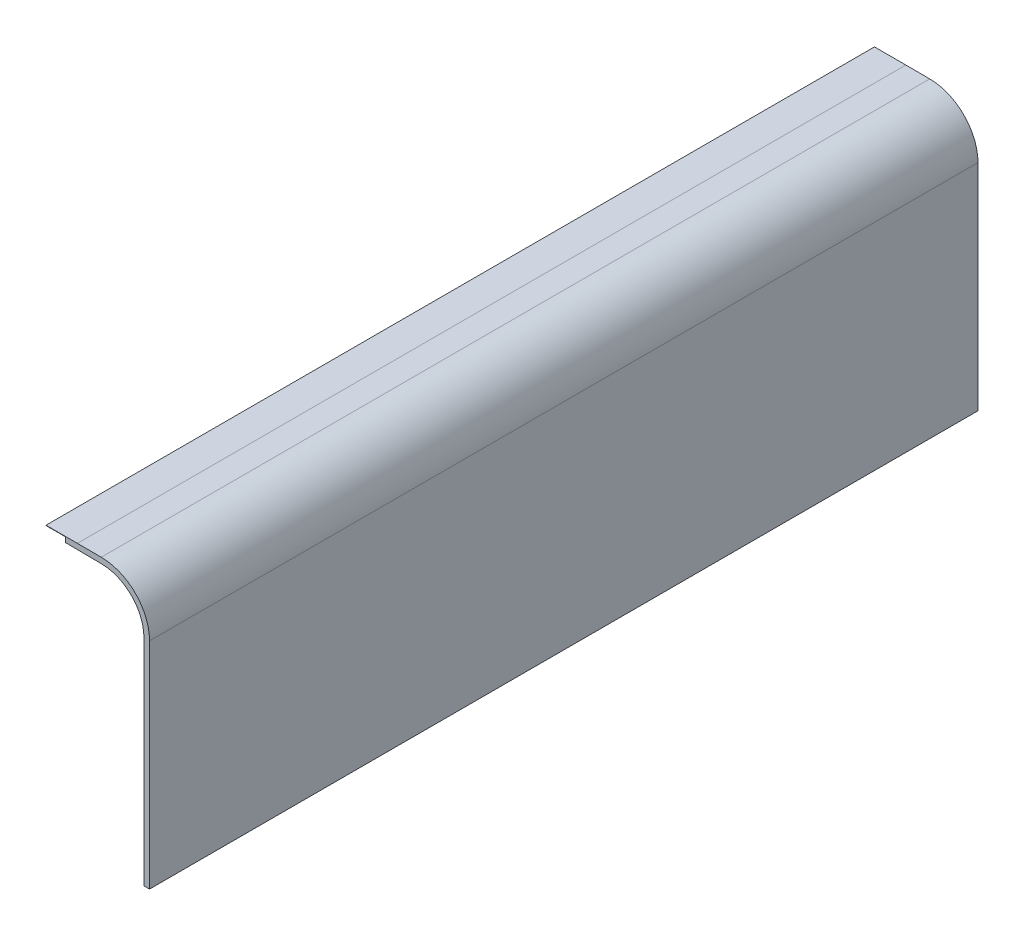
ISO-10303-21;
HEADER;
FILE_DESCRIPTION(('STEP AP214'),'2;1');
FILE_NAME('part.step','',(''),(''),'','','');
FILE_SCHEMA(('AUTOMOTIVE_DESIGN { 1 0 10303 214 1 1 1 1 }'));
ENDSEC;
DATA;
#1=APPLICATION_CONTEXT('core data for automotive mechanical design processes');
#2=APPLICATION_PROTOCOL_DEFINITION('international standard','automotive_design',2000,#1);
#3=PRODUCT_CONTEXT('',#1,'mechanical');
#4=PRODUCT('Part','Part','',(#3));
#5=PRODUCT_RELATED_PRODUCT_CATEGORY('part','',(#4));
#6=PRODUCT_DEFINITION_FORMATION('','',#4);
#7=PRODUCT_DEFINITION_CONTEXT('part definition',#1,'design');
#8=PRODUCT_DEFINITION('design','',#6,#7);
#9=PRODUCT_DEFINITION_SHAPE('','',#8);
#10=(LENGTH_UNIT() NAMED_UNIT(*) SI_UNIT(.MILLI.,.METRE.));
#11=(NAMED_UNIT(*) PLANE_ANGLE_UNIT() SI_UNIT($,.RADIAN.));
#12=(NAMED_UNIT(*) SI_UNIT($,.STERADIAN.) SOLID_ANGLE_UNIT());
#13=UNCERTAINTY_MEASURE_WITH_UNIT(LENGTH_MEASURE(1.E-05),#10,'distance_accuracy_value','');
#14=(GEOMETRIC_REPRESENTATION_CONTEXT(3) GLOBAL_UNCERTAINTY_ASSIGNED_CONTEXT((#13)) GLOBAL_UNIT_ASSIGNED_CONTEXT((#10,
#11,#12)) REPRESENTATION_CONTEXT('',''));
#15=CARTESIAN_POINT('',(0.,0.,0.));
#16=DIRECTION('',(0.,0.,1.));
#17=DIRECTION('',(1.,0.,0.));
#18=AXIS2_PLACEMENT_3D('',#15,#16,#17);
#19=CARTESIAN_POINT('',(459.721789204401,-469.899999999951,-1983.03160275972));
#20=DIRECTION('',(0.,-1.,0.));
#21=DIRECTION('',(0.,0.,-1.));
#22=AXIS2_PLACEMENT_3D('',#19,#20,#21);
#23=PLANE('',#22);
#24=DIRECTION('',(-1.,0.,0.));
#25=VECTOR('',#24,1.);
#26=CARTESIAN_POINT('',(459.721789204401,-469.899999999951,-1478.12000003458));
#27=LINE('',#26,#25);
#28=CARTESIAN_POINT('',(469.721789204401,-469.899999999951,-1478.12000003458));
#29=VERTEX_POINT('',#28);
#30=CARTESIAN_POINT('',(459.721789204401,-469.899999999951,-1478.12000003458));
#31=VERTEX_POINT('',#30);
#32=EDGE_CURVE('E43',#29,#31,#27,.T.);
#33=ORIENTED_EDGE('',*,*,#32,.F.);
#34=DIRECTION('',(0.,0.,1.));
#35=VECTOR('',#34,1.);
#36=CARTESIAN_POINT('',(469.721789204401,-469.899999999951,-1983.03160275972));
#37=LINE('',#36,#35);
#38=CARTESIAN_POINT('',(469.721789204401,-469.899999999951,0.));
#39=VERTEX_POINT('',#38);
#40=EDGE_CURVE('E116',#29,#39,#37,.T.);
#41=ORIENTED_EDGE('',*,*,#40,.T.);
#42=DIRECTION('',(1.,0.,0.));
#43=VECTOR('',#42,1.);
#44=CARTESIAN_POINT('',(459.721789204401,-469.899999999951,0.));
#45=LINE('',#44,#43);
#46=CARTESIAN_POINT('',(459.721789204401,-469.899999999951,0.));
#47=VERTEX_POINT('',#46);
#48=EDGE_CURVE('E120',#47,#39,#45,.T.);
#49=ORIENTED_EDGE('',*,*,#48,.F.);
#50=DIRECTION('',(0.,0.,1.));
#51=VECTOR('',#50,1.);
#52=CARTESIAN_POINT('',(459.721789204401,-469.899999999951,-1983.03160275972));
#53=LINE('',#52,#51);
#54=EDGE_CURVE('E164',#31,#47,#53,.T.);
#55=ORIENTED_EDGE('',*,*,#54,.F.);
#56=EDGE_LOOP('',(#33,#41,#49,#55));
#57=FACE_BOUND('',#56,.T.);
#58=ADVANCED_FACE('F36',(#57),#23,.T.);
#59=CARTESIAN_POINT('',(459.721789204401,-469.899999999951,-1983.03160275972));
#60=DIRECTION('',(-1.,0.,0.));
#61=DIRECTION('',(0.,0.,1.));
#62=AXIS2_PLACEMENT_3D('',#59,#60,#61);
#63=PLANE('',#62);
#64=DIRECTION('',(0.,1.,0.));
#65=VECTOR('',#64,1.);
#66=CARTESIAN_POINT('',(459.721789204401,-469.899999999951,-1478.12000003458));
#67=LINE('',#66,#65);
#68=CARTESIAN_POINT('',(459.721789204401,-86.3600000000001,-1478.12000003458));
#69=VERTEX_POINT('',#68);
#70=EDGE_CURVE('E225',#31,#69,#67,.T.);
#71=ORIENTED_EDGE('',*,*,#70,.F.);
#72=ORIENTED_EDGE('',*,*,#54,.T.);
#73=DIRECTION('',(0.,-1.,0.));
#74=VECTOR('',#73,1.);
#75=CARTESIAN_POINT('',(459.721789204401,-469.899999999951,0.));
#76=LINE('',#75,#74);
#77=CARTESIAN_POINT('',(459.721789204401,-86.3600000000001,0.));
#78=VERTEX_POINT('',#77);
#79=EDGE_CURVE('E125',#78,#47,#76,.T.);
#80=ORIENTED_EDGE('',*,*,#79,.F.);
#81=DIRECTION('',(0.,0.,1.));
#82=VECTOR('',#81,1.);
#83=CARTESIAN_POINT('',(459.721789204401,-86.3600000000001,-1983.03160275972));
#84=LINE('',#83,#82);
#85=EDGE_CURVE('E167',#69,#78,#84,.T.);
#86=ORIENTED_EDGE('',*,*,#85,.F.);
#87=EDGE_LOOP('',(#71,#72,#80,#86));
#88=FACE_BOUND('',#87,.T.);
#89=ADVANCED_FACE('F224',(#88),#63,.T.);
#90=CARTESIAN_POINT('',(383.521789204401,-86.3600000000001,-1983.03160275972));
#91=DIRECTION('',(0.,0.,1.));
#92=DIRECTION('',(1.,0.,0.));
#93=AXIS2_PLACEMENT_3D('',#90,#91,#92);
#94=CYLINDRICAL_SURFACE('',#93,76.2);
#95=CARTESIAN_POINT('',(383.521789204401,-86.3600000000001,-1478.12000003458));
#96=DIRECTION('',(0.,0.,1.));
#97=DIRECTION('',(1.,0.,0.));
#98=AXIS2_PLACEMENT_3D('',#95,#96,#97);
#99=CIRCLE('',#98,76.2);
#100=CARTESIAN_POINT('',(383.521789204401,-10.1600000000001,-1478.12000003458));
#101=VERTEX_POINT('',#100);
#102=EDGE_CURVE('E226',#69,#101,#99,.T.);
#103=ORIENTED_EDGE('',*,*,#102,.F.);
#104=ORIENTED_EDGE('',*,*,#85,.T.);
#105=CARTESIAN_POINT('',(383.521789204401,-86.3600000000001,0.));
#106=DIRECTION('',(0.,0.,-1.));
#107=DIRECTION('',(1.,0.,0.));
#108=AXIS2_PLACEMENT_3D('',#105,#106,#107);
#109=CIRCLE('',#108,76.2);
#110=CARTESIAN_POINT('',(383.521789204401,-10.1600000000001,0.));
#111=VERTEX_POINT('',#110);
#112=EDGE_CURVE('E161',#111,#78,#109,.T.);
#113=ORIENTED_EDGE('',*,*,#112,.F.);
#114=DIRECTION('',(0.,0.,1.));
#115=VECTOR('',#114,1.);
#116=CARTESIAN_POINT('',(383.521789204401,-10.1600000000001,-1983.03160275972));
#117=LINE('',#116,#115);
#118=EDGE_CURVE('E169',#101,#111,#117,.T.);
#119=ORIENTED_EDGE('',*,*,#118,.F.);
#120=EDGE_LOOP('',(#103,#104,#113,#119));
#121=FACE_BOUND('',#120,.T.);
#122=ADVANCED_FACE('F220',(#121),#94,.F.);
#123=CARTESIAN_POINT('',(383.521789204401,-10.1600000000001,-1983.03160275972));
#124=DIRECTION('',(-0.0103931394222507,-0.999945989867928,0.));
#125=DIRECTION('',(0.999945989867928,-0.0103931394222507,0.));
#126=AXIS2_PLACEMENT_3D('',#123,#124,#125);
#127=PLANE('',#126);
#128=DIRECTION('',(-0.999945989867928,0.0103931394222507,0.));
#129=VECTOR('',#128,1.);
#130=CARTESIAN_POINT('',(383.521789204401,-10.1600000000001,-1478.12000003458));
#131=LINE('',#130,#129);
#132=CARTESIAN_POINT('',(320.021789204402,-9.50000000000001,-1478.12000003458));
#133=VERTEX_POINT('',#132);
#134=EDGE_CURVE('E217',#101,#133,#131,.T.);
#135=ORIENTED_EDGE('',*,*,#134,.F.);
#136=ORIENTED_EDGE('',*,*,#118,.T.);
#137=DIRECTION('',(0.999945989867928,-0.0103931394222507,0.));
#138=VECTOR('',#137,1.);
#139=CARTESIAN_POINT('',(383.521789204401,-10.1600000000001,0.));
#140=LINE('',#139,#138);
#141=CARTESIAN_POINT('',(320.021789204402,-9.50000000000001,0.));
#142=VERTEX_POINT('',#141);
#143=EDGE_CURVE('E158',#142,#111,#140,.T.);
#144=ORIENTED_EDGE('',*,*,#143,.F.);
#145=DIRECTION('',(0.,0.,1.));
#146=VECTOR('',#145,1.);
#147=CARTESIAN_POINT('',(320.021789204402,-9.50000000000001,-1983.03160275972));
#148=LINE('',#147,#146);
#149=EDGE_CURVE('E171',#133,#142,#148,.T.);
#150=ORIENTED_EDGE('',*,*,#149,.F.);
#151=EDGE_LOOP('',(#135,#136,#144,#150));
#152=FACE_BOUND('',#151,.T.);
#153=ADVANCED_FACE('F214',(#152),#127,.T.);
#154=CARTESIAN_POINT('',(320.021789204402,-0.6,-1983.03160275972));
#155=DIRECTION('',(-1.,0.,0.));
#156=DIRECTION('',(0.,0.,1.));
#157=AXIS2_PLACEMENT_3D('',#154,#155,#156);
#158=PLANE('',#157);
#159=DIRECTION('',(0.,1.,0.));
#160=VECTOR('',#159,1.);
#161=CARTESIAN_POINT('',(320.021789204402,-0.6,-1478.12000003458));
#162=LINE('',#161,#160);
#163=CARTESIAN_POINT('',(320.021789204402,-0.6,-1478.12000003458));
#164=VERTEX_POINT('',#163);
#165=EDGE_CURVE('E211',#133,#164,#162,.T.);
#166=ORIENTED_EDGE('',*,*,#165,.F.);
#167=ORIENTED_EDGE('',*,*,#149,.T.);
#168=DIRECTION('',(0.,-1.,0.));
#169=VECTOR('',#168,1.);
#170=CARTESIAN_POINT('',(320.021789204402,-0.6,0.));
#171=LINE('',#170,#169);
#172=CARTESIAN_POINT('',(320.021789204402,-0.6,0.));
#173=VERTEX_POINT('',#172);
#174=EDGE_CURVE('E155',#173,#142,#171,.T.);
#175=ORIENTED_EDGE('',*,*,#174,.F.);
#176=DIRECTION('',(0.,0.,1.));
#177=VECTOR('',#176,1.);
#178=CARTESIAN_POINT('',(320.021789204402,-0.6,-1983.03160275972));
#179=LINE('',#178,#177);
#180=EDGE_CURVE('E173',#164,#173,#179,.T.);
#181=ORIENTED_EDGE('',*,*,#180,.F.);
#182=EDGE_LOOP('',(#166,#167,#175,#181));
#183=FACE_BOUND('',#182,.T.);
#184=ADVANCED_FACE('F209',(#183),#158,.T.);
#185=CARTESIAN_POINT('',(284.97949148535,-0.6,-1983.03160275972));
#186=DIRECTION('',(0.,-1.,0.));
#187=DIRECTION('',(1.,0.,0.));
#188=AXIS2_PLACEMENT_3D('',#185,#186,#187);
#189=PLANE('',#188);
#190=DIRECTION('',(-1.,0.,0.));
#191=VECTOR('',#190,1.);
#192=CARTESIAN_POINT('',(284.97949148535,-0.6,-1478.12000003458));
#193=LINE('',#192,#191);
#194=CARTESIAN_POINT('',(284.97949148535,-0.6,-1478.12000003458));
#195=VERTEX_POINT('',#194);
#196=EDGE_CURVE('E231',#164,#195,#193,.T.);
#197=ORIENTED_EDGE('',*,*,#196,.F.);
#198=ORIENTED_EDGE('',*,*,#180,.T.);
#199=DIRECTION('',(1.,0.,0.));
#200=VECTOR('',#199,1.);
#201=CARTESIAN_POINT('',(284.97949148535,-0.6,0.));
#202=LINE('',#201,#200);
#203=CARTESIAN_POINT('',(284.97949148535,-0.6,0.));
#204=VERTEX_POINT('',#203);
#205=EDGE_CURVE('E152',#204,#173,#202,.T.);
#206=ORIENTED_EDGE('',*,*,#205,.F.);
#207=DIRECTION('',(0.,0.,1.));
#208=VECTOR('',#207,1.);
#209=CARTESIAN_POINT('',(284.97949148535,-0.6,-1983.03160275972));
#210=LINE('',#209,#208);
#211=EDGE_CURVE('E175',#195,#204,#210,.T.);
#212=ORIENTED_EDGE('',*,*,#211,.F.);
#213=EDGE_LOOP('',(#197,#198,#206,#212));
#214=FACE_BOUND('',#213,.T.);
#215=ADVANCED_FACE('F203',(#214),#189,.T.);
#216=CARTESIAN_POINT('',(284.97949148535,0.,-1983.03160275972));
#217=DIRECTION('',(-1.,0.,0.));
#218=DIRECTION('',(0.,0.,1.));
#219=AXIS2_PLACEMENT_3D('',#216,#217,#218);
#220=PLANE('',#219);
#221=DIRECTION('',(0.,1.,0.));
#222=VECTOR('',#221,1.);
#223=CARTESIAN_POINT('',(284.97949148535,0.,-1478.12000003458));
#224=LINE('',#223,#222);
#225=CARTESIAN_POINT('',(284.97949148535,0.,-1478.12000003458));
#226=VERTEX_POINT('',#225);
#227=EDGE_CURVE('E200',#195,#226,#224,.T.);
#228=ORIENTED_EDGE('',*,*,#227,.F.);
#229=ORIENTED_EDGE('',*,*,#211,.T.);
#230=DIRECTION('',(0.,-1.,0.));
#231=VECTOR('',#230,1.);
#232=CARTESIAN_POINT('',(284.97949148535,0.,0.));
#233=LINE('',#232,#231);
#234=CARTESIAN_POINT('',(284.97949148535,0.,0.));
#235=VERTEX_POINT('',#234);
#236=EDGE_CURVE('E149',#235,#204,#233,.T.);
#237=ORIENTED_EDGE('',*,*,#236,.F.);
#238=DIRECTION('',(0.,0.,1.));
#239=VECTOR('',#238,1.);
#240=CARTESIAN_POINT('',(284.97949148535,0.,-1983.03160275972));
#241=LINE('',#240,#239);
#242=EDGE_CURVE('E177',#226,#235,#241,.T.);
#243=ORIENTED_EDGE('',*,*,#242,.F.);
#244=EDGE_LOOP('',(#228,#229,#237,#243));
#245=FACE_BOUND('',#244,.T.);
#246=ADVANCED_FACE('F197',(#245),#220,.T.);
#247=CARTESIAN_POINT('',(340.976408313391,0.,-1983.03160275972));
#248=DIRECTION('',(0.,1.,0.));
#249=DIRECTION('',(-1.,0.,0.));
#250=AXIS2_PLACEMENT_3D('',#247,#248,#249);
#251=PLANE('',#250);
#252=DIRECTION('',(1.,0.,0.));
#253=VECTOR('',#252,1.);
#254=CARTESIAN_POINT('',(340.976408313391,0.,-1478.12000003458));
#255=LINE('',#254,#253);
#256=CARTESIAN_POINT('',(340.976408313391,0.,-1478.12000003458));
#257=VERTEX_POINT('',#256);
#258=EDGE_CURVE('E55',#226,#257,#255,.T.);
#259=ORIENTED_EDGE('',*,*,#258,.F.);
#260=ORIENTED_EDGE('',*,*,#242,.T.);
#261=DIRECTION('',(-1.,0.,0.));
#262=VECTOR('',#261,1.);
#263=CARTESIAN_POINT('',(340.976408313391,0.,0.));
#264=LINE('',#263,#262);
#265=CARTESIAN_POINT('',(340.976408313391,0.,0.));
#266=VERTEX_POINT('',#265);
#267=EDGE_CURVE('E146',#266,#235,#264,.T.);
#268=ORIENTED_EDGE('',*,*,#267,.F.);
#269=DIRECTION('',(0.,0.,1.));
#270=VECTOR('',#269,1.);
#271=CARTESIAN_POINT('',(340.976408313391,0.,-1983.03160275972));
#272=LINE('',#271,#270);
#273=EDGE_CURVE('E179',#257,#266,#272,.T.);
#274=ORIENTED_EDGE('',*,*,#273,.F.);
#275=EDGE_LOOP('',(#259,#260,#268,#274));
#276=FACE_BOUND('',#275,.T.);
#277=ADVANCED_FACE('F193',(#276),#251,.T.);
#278=CARTESIAN_POINT('',(383.541163500031,-0.160002177281626,-1983.03160275972));
#279=DIRECTION('',(0.00375900310367853,0.999992934922876,0.));
#280=DIRECTION('',(-0.999992934922876,0.00375900310367853,0.));
#281=AXIS2_PLACEMENT_3D('',#278,#279,#280);
#282=PLANE('',#281);
#283=DIRECTION('',(0.999992934922876,-0.00375900310367853,0.));
#284=VECTOR('',#283,1.);
#285=CARTESIAN_POINT('',(383.541163500031,-0.160002177281626,-1478.12000003458));
#286=LINE('',#285,#284);
#287=CARTESIAN_POINT('',(383.541163500031,-0.160002177281612,-1478.12000003458));
#288=VERTEX_POINT('',#287);
#289=EDGE_CURVE('E50',#257,#288,#286,.T.);
#290=ORIENTED_EDGE('',*,*,#289,.F.);
#291=ORIENTED_EDGE('',*,*,#273,.T.);
#292=DIRECTION('',(-0.999992934922876,0.00375900310367853,0.));
#293=VECTOR('',#292,1.);
#294=CARTESIAN_POINT('',(383.541163500031,-0.160002177281626,0.));
#295=LINE('',#294,#293);
#296=CARTESIAN_POINT('',(383.541163500031,-0.160002177281626,0.));
#297=VERTEX_POINT('',#296);
#298=EDGE_CURVE('E143',#297,#266,#295,.T.);
#299=ORIENTED_EDGE('',*,*,#298,.F.);
#300=DIRECTION('',(0.,0.,1.));
#301=VECTOR('',#300,1.);
#302=CARTESIAN_POINT('',(383.541163500031,-0.160002177281626,-1983.03160275972));
#303=LINE('',#302,#301);
#304=EDGE_CURVE('E181',#288,#297,#303,.T.);
#305=ORIENTED_EDGE('',*,*,#304,.F.);
#306=EDGE_LOOP('',(#290,#291,#299,#305));
#307=FACE_BOUND('',#306,.T.);
#308=ADVANCED_FACE('F188',(#307),#282,.T.);
#309=CARTESIAN_POINT('',(383.521789204401,-86.3600000000001,-1983.03160275972));
#310=DIRECTION('',(0.,0.,1.));
#311=DIRECTION('',(1.,0.,0.));
#312=AXIS2_PLACEMENT_3D('',#309,#310,#311);
#313=CYLINDRICAL_SURFACE('',#312,86.2);
#314=CARTESIAN_POINT('',(383.521789204401,-86.3600000000001,-1478.12000003458));
#315=DIRECTION('',(0.,0.,1.));
#316=DIRECTION('',(1.,0.,0.));
#317=AXIS2_PLACEMENT_3D('',#314,#315,#316);
#318=CIRCLE('',#317,86.2);
#319=CARTESIAN_POINT('',(469.721789204401,-86.3600000000001,-1478.12000003458));
#320=VERTEX_POINT('',#319);
#321=EDGE_CURVE('E166',#288,#320,#318,.F.);
#322=ORIENTED_EDGE('',*,*,#321,.F.);
#323=ORIENTED_EDGE('',*,*,#304,.T.);
#324=CARTESIAN_POINT('',(383.521789204401,-86.3600000000001,0.));
#325=DIRECTION('',(0.,0.,1.));
#326=DIRECTION('',(1.,0.,0.));
#327=AXIS2_PLACEMENT_3D('',#324,#325,#326);
#328=CIRCLE('',#327,86.2);
#329=CARTESIAN_POINT('',(469.721789204401,-86.3600000000001,0.));
#330=VERTEX_POINT('',#329);
#331=EDGE_CURVE('E133',#330,#297,#328,.T.);
#332=ORIENTED_EDGE('',*,*,#331,.F.);
#333=DIRECTION('',(0.,0.,1.));
#334=VECTOR('',#333,1.);
#335=CARTESIAN_POINT('',(469.721789204401,-86.3600000000001,-1983.03160275972));
#336=LINE('',#335,#334);
#337=EDGE_CURVE('E124',#320,#330,#336,.T.);
#338=ORIENTED_EDGE('',*,*,#337,.F.);
#339=EDGE_LOOP('',(#322,#323,#332,#338));
#340=FACE_BOUND('',#339,.T.);
#341=ADVANCED_FACE('F186',(#340),#313,.T.);
#342=CARTESIAN_POINT('',(469.721789204401,-469.899999999951,-1983.03160275972));
#343=DIRECTION('',(1.,0.,0.));
#344=DIRECTION('',(0.,0.,-1.));
#345=AXIS2_PLACEMENT_3D('',#342,#343,#344);
#346=PLANE('',#345);
#347=DIRECTION('',(0.,-1.,0.));
#348=VECTOR('',#347,1.);
#349=CARTESIAN_POINT('',(469.721789204401,-469.899999999951,-1478.12000003458));
#350=LINE('',#349,#348);
#351=EDGE_CURVE('E11',#320,#29,#350,.T.);
#352=ORIENTED_EDGE('',*,*,#351,.F.);
#353=ORIENTED_EDGE('',*,*,#337,.T.);
#354=DIRECTION('',(0.,1.,0.));
#355=VECTOR('',#354,1.);
#356=CARTESIAN_POINT('',(469.721789204401,-469.899999999951,0.));
#357=LINE('',#356,#355);
#358=EDGE_CURVE('E127',#39,#330,#357,.T.);
#359=ORIENTED_EDGE('',*,*,#358,.F.);
#360=ORIENTED_EDGE('',*,*,#40,.F.);
#361=EDGE_LOOP('',(#352,#353,#359,#360));
#362=FACE_BOUND('',#361,.T.);
#363=ADVANCED_FACE('F128',(#362),#346,.T.);
#364=CARTESIAN_POINT('',(383.521789204401,-86.3600000000001,0.));
#365=DIRECTION('',(0.,0.,1.));
#366=DIRECTION('',(1.,0.,0.));
#367=AXIS2_PLACEMENT_3D('',#364,#365,#366);
#368=PLANE('',#367);
#369=ORIENTED_EDGE('',*,*,#48,.T.);
#370=ORIENTED_EDGE('',*,*,#358,.T.);
#371=ORIENTED_EDGE('',*,*,#331,.T.);
#372=ORIENTED_EDGE('',*,*,#298,.T.);
#373=ORIENTED_EDGE('',*,*,#267,.T.);
#374=ORIENTED_EDGE('',*,*,#236,.T.);
#375=ORIENTED_EDGE('',*,*,#205,.T.);
#376=ORIENTED_EDGE('',*,*,#174,.T.);
#377=ORIENTED_EDGE('',*,*,#143,.T.);
#378=ORIENTED_EDGE('',*,*,#112,.T.);
#379=ORIENTED_EDGE('',*,*,#79,.T.);
#380=EDGE_LOOP('',(#369,#370,#371,#372,#373,#374,#375,#376,#377,#378,#379));
#381=FACE_BOUND('',#380,.T.);
#382=ADVANCED_FACE('F135',(#381),#368,.T.);
#383=CARTESIAN_POINT('',(-383.521789204399,-86.3600000000127,-1478.12000003458));
#384=DIRECTION('',(0.,0.,1.));
#385=DIRECTION('',(-1.,0.,0.));
#386=AXIS2_PLACEMENT_3D('',#383,#384,#385);
#387=PLANE('',#386);
#388=ORIENTED_EDGE('',*,*,#32,.T.);
#389=ORIENTED_EDGE('',*,*,#70,.T.);
#390=ORIENTED_EDGE('',*,*,#102,.T.);
#391=ORIENTED_EDGE('',*,*,#134,.T.);
#392=ORIENTED_EDGE('',*,*,#165,.T.);
#393=ORIENTED_EDGE('',*,*,#196,.T.);
#394=ORIENTED_EDGE('',*,*,#227,.T.);
#395=ORIENTED_EDGE('',*,*,#258,.T.);
#396=ORIENTED_EDGE('',*,*,#289,.T.);
#397=ORIENTED_EDGE('',*,*,#321,.T.);
#398=ORIENTED_EDGE('',*,*,#351,.T.);
#399=EDGE_LOOP('',(#388,#389,#390,#391,#392,#393,#394,#395,#396,#397,#398));
#400=FACE_BOUND('',#399,.T.);
#401=ADVANCED_FACE('F236',(#400),#387,.F.);
#402=CLOSED_SHELL('',(#58,#89,#122,#153,#184,#215,#246,#277,#308,#341,#363,#382,#401));
#403=MANIFOLD_SOLID_BREP('B2',#402);
#404=ADVANCED_BREP_SHAPE_REPRESENTATION('',(#18,#403),#14);
#405=SHAPE_DEFINITION_REPRESENTATION(#9,#404);
ENDSEC;
END-ISO-10303-21;
